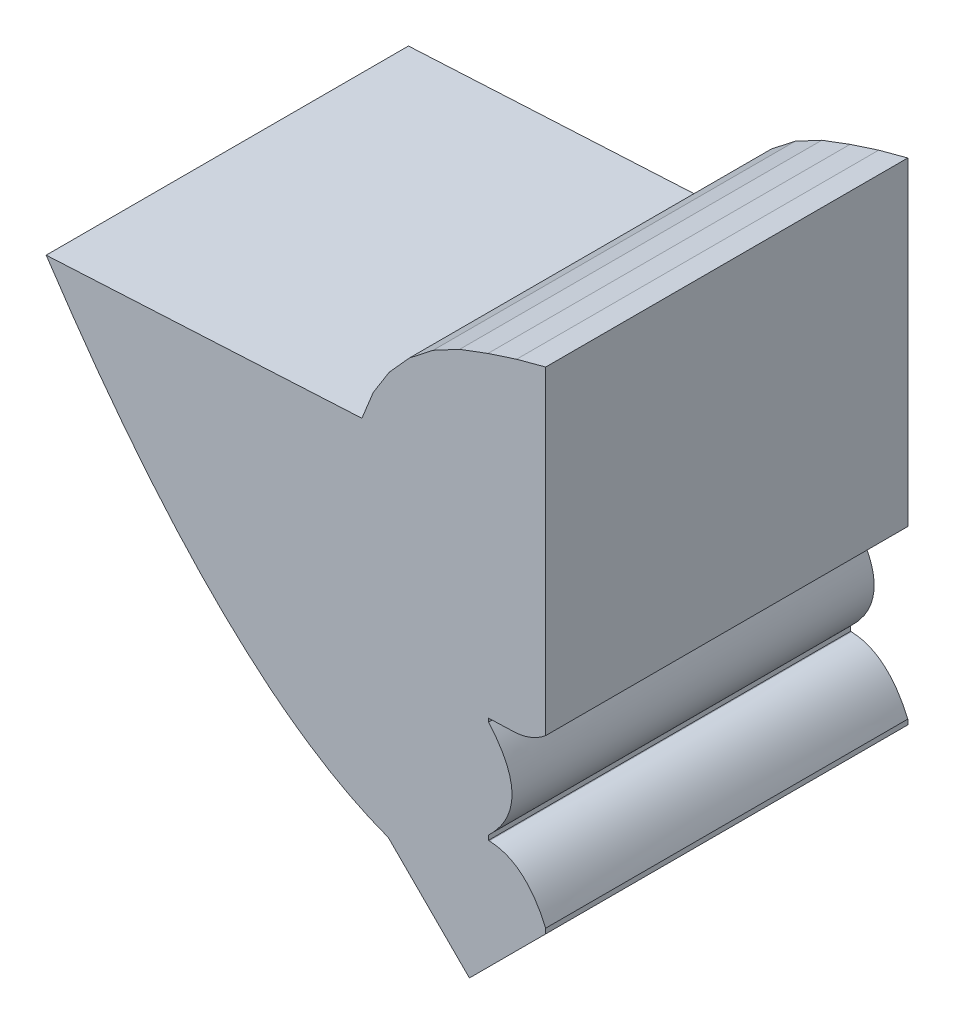
ISO-10303-21;
HEADER;
FILE_DESCRIPTION(('STEP AP214'),'2;1');
FILE_NAME('part.step','',(''),(''),'','','');
FILE_SCHEMA(('AUTOMOTIVE_DESIGN { 1 0 10303 214 1 1 1 1 }'));
ENDSEC;
DATA;
#1=APPLICATION_CONTEXT('core data for automotive mechanical design processes');
#2=APPLICATION_PROTOCOL_DEFINITION('international standard','automotive_design',2000,#1);
#3=PRODUCT_CONTEXT('',#1,'mechanical');
#4=PRODUCT('Part','Part','',(#3));
#5=PRODUCT_RELATED_PRODUCT_CATEGORY('part','',(#4));
#6=PRODUCT_DEFINITION_FORMATION('','',#4);
#7=PRODUCT_DEFINITION_CONTEXT('part definition',#1,'design');
#8=PRODUCT_DEFINITION('design','',#6,#7);
#9=PRODUCT_DEFINITION_SHAPE('','',#8);
#10=(LENGTH_UNIT() NAMED_UNIT(*) SI_UNIT(.MILLI.,.METRE.));
#11=(NAMED_UNIT(*) PLANE_ANGLE_UNIT() SI_UNIT($,.RADIAN.));
#12=(NAMED_UNIT(*) SI_UNIT($,.STERADIAN.) SOLID_ANGLE_UNIT());
#13=UNCERTAINTY_MEASURE_WITH_UNIT(LENGTH_MEASURE(1.E-05),#10,'distance_accuracy_value','');
#14=(GEOMETRIC_REPRESENTATION_CONTEXT(3) GLOBAL_UNCERTAINTY_ASSIGNED_CONTEXT((#13)) GLOBAL_UNIT_ASSIGNED_CONTEXT((#10,
#11,#12)) REPRESENTATION_CONTEXT('',''));
#15=CARTESIAN_POINT('',(0.,0.,0.));
#16=DIRECTION('',(0.,0.,1.));
#17=DIRECTION('',(1.,0.,0.));
#18=AXIS2_PLACEMENT_3D('',#15,#16,#17);
#19=CARTESIAN_POINT('',(-2.17733041778456,0.,7.21));
#20=DIRECTION('',(1.,0.,0.));
#21=DIRECTION('',(0.,1.,0.));
#22=AXIS2_PLACEMENT_3D('',#19,#20,#21);
#23=PLANE('',#22);
#24=DIRECTION('',(0.,1.,0.));
#25=VECTOR('',#24,1.);
#26=CARTESIAN_POINT('',(-2.17733041778456,0.,7.21));
#27=LINE('',#26,#25);
#28=CARTESIAN_POINT('',(-2.17733041779455,-1.68817652024789,7.21));
#29=VERTEX_POINT('',#28);
#30=CARTESIAN_POINT('',(-2.17733041778456,-1.87464458451844,7.21));
#31=VERTEX_POINT('',#30);
#32=EDGE_CURVE('E555',#29,#31,#27,.F.);
#33=ORIENTED_EDGE('',*,*,#32,.T.);
#34=DIRECTION('',(0.,0.,-1.));
#35=VECTOR('',#34,1.);
#36=CARTESIAN_POINT('',(-2.17733041778456,-1.87464458451844,7.21));
#37=LINE('',#36,#35);
#38=CARTESIAN_POINT('',(-2.17733041778456,-1.87464458451844,-7.21));
#39=VERTEX_POINT('',#38);
#40=EDGE_CURVE('E13',#31,#39,#37,.T.);
#41=ORIENTED_EDGE('',*,*,#40,.T.);
#42=DIRECTION('',(0.,1.,0.));
#43=VECTOR('',#42,1.);
#44=CARTESIAN_POINT('',(-2.17733041778456,0.,-7.21));
#45=LINE('',#44,#43);
#46=CARTESIAN_POINT('',(-2.17733041778456,-1.68817652020115,-7.21));
#47=VERTEX_POINT('',#46);
#48=EDGE_CURVE('E221',#47,#39,#45,.F.);
#49=ORIENTED_EDGE('',*,*,#48,.F.);
#50=DIRECTION('',(0.,0.,-1.));
#51=VECTOR('',#50,1.);
#52=CARTESIAN_POINT('',(-2.17733041778328,-1.68817652023794,30.8299178698776));
#53=LINE('',#52,#51);
#54=EDGE_CURVE('E594',#29,#47,#53,.T.);
#55=ORIENTED_EDGE('',*,*,#54,.F.);
#56=EDGE_LOOP('',(#33,#41,#49,#55));
#57=FACE_BOUND('',#56,.T.);
#58=ADVANCED_FACE('F59',(#57),#23,.T.);
#59=CARTESIAN_POINT('',(-82931.1005830976,996560.072871644,30.8299178698776));
#60=CARTESIAN_POINT('',(87153.8887538027,-996199.093812144,30.8299178698776));
#61=CARTESIAN_POINT('',(-91384.0928999308,995820.531871049,30.8299178698776));
#62=B_SPLINE_CURVE_WITH_KNOTS('',2,(#59,#60,#61),.UNSPECIFIED.,.F.,.F.,(3,3),(0.,1.),.UNSPECIFIED.);
#63=DIRECTION('',(0.,0.,-1.));
#64=VECTOR('',#63,1.);
#65=SURFACE_OF_LINEAR_EXTRUSION('',#62,#64);
#66=CARTESIAN_POINT('',(-10.3360060158818,-1.39847805226852,-7.21));
#67=CARTESIAN_POINT('',(-8.21435068380829,-3.01457076583251,-7.21));
#68=CARTESIAN_POINT('',(-6.16806887334853,-3.76914018510849,-7.21));
#69=B_SPLINE_CURVE_WITH_KNOTS('',2,(#66,#67,#68),.UNSPECIFIED.,.F.,.F.,(3,3),(0.500500048072499,
0.500965025000237),.UNSPECIFIED.);
#70=CARTESIAN_POINT('',(-10.3360060158632,-1.39847805228234,-7.2125366176972));
#71=VERTEX_POINT('',#70);
#72=CARTESIAN_POINT('',(-6.16806886859999,-3.76914018684615,-7.21));
#73=VERTEX_POINT('',#72);
#74=EDGE_CURVE('E551',#71,#73,#69,.T.);
#75=ORIENTED_EDGE('',*,*,#74,.T.);
#76=DIRECTION('',(0.,0.,-1.));
#77=VECTOR('',#76,1.);
#78=CARTESIAN_POINT('',(-6.16806886857457,-3.76914018687113,0.));
#79=LINE('',#78,#77);
#80=CARTESIAN_POINT('',(-6.16806891386247,-3.76914017017464,7.21));
#81=VERTEX_POINT('',#80);
#82=EDGE_CURVE('E65',#73,#81,#79,.F.);
#83=ORIENTED_EDGE('',*,*,#82,.T.);
#84=CARTESIAN_POINT('',(-6.16806891386101,-3.76914017017338,7.21));
#85=CARTESIAN_POINT('',(-8.21435070480994,-3.0145707498392,7.21));
#86=CARTESIAN_POINT('',(-10.3360060158803,-1.3984780522741,7.21));
#87=B_SPLINE_CURVE_WITH_KNOTS('',2,(#84,#85,#86),.UNSPECIFIED.,.F.,.F.,(3,3),(0.500500048077102,
0.500965025000236),.UNSPECIFIED.);
#88=CARTESIAN_POINT('',(-10.3360060158816,-1.39847805227263,7.21251805157951));
#89=VERTEX_POINT('',#88);
#90=EDGE_CURVE('E525',#89,#81,#87,.F.);
#91=ORIENTED_EDGE('',*,*,#90,.F.);
#92=CARTESIAN_POINT('',(-10.336006015861,-1.39847805228632,7.21));
#93=CARTESIAN_POINT('',(-10.6228848167366,-1.17995870432205,7.21));
#94=CARTESIAN_POINT('',(-10.9111416710362,-0.945688133646021,7.21));
#95=B_SPLINE_CURVE_WITH_KNOTS('',2,(#92,#93,#94),.UNSPECIFIED.,.F.,.F.,(3,3),(0.500965025000234,
0.501027896674745),.UNSPECIFIED.);
#96=CARTESIAN_POINT('',(-10.9111416711035,-0.945688133586594,7.21251805157951));
#97=VERTEX_POINT('',#96);
#98=EDGE_CURVE('E460',#97,#89,#95,.F.);
#99=ORIENTED_EDGE('',*,*,#98,.F.);
#100=CARTESIAN_POINT('',(-10.9111416711694,-0.945688133531575,7.21));
#101=CARTESIAN_POINT('',(-15.1971813204195,2.53763911301365,7.21));
#102=CARTESIAN_POINT('',(-19.7878835648669,9.50327575735757,7.21));
#103=B_SPLINE_CURVE_WITH_KNOTS('',2,(#100,#101,#102),.UNSPECIFIED.,.F.,.F.,(3,3),
(0.501027896674761,0.501962724366634),.UNSPECIFIED.);
#104=CARTESIAN_POINT('',(-19.7878835648708,9.50327575735899,7.21251805157951));
#105=VERTEX_POINT('',#104);
#106=EDGE_CURVE('E514',#105,#97,#103,.F.);
#107=ORIENTED_EDGE('',*,*,#106,.F.);
#108=DIRECTION('',(0.,0.,1.));
#109=VECTOR('',#108,1.);
#110=CARTESIAN_POINT('',(-19.7878835648708,9.50327575735899,-7.21507323539439));
#111=LINE('',#110,#109);
#112=CARTESIAN_POINT('',(-19.7878835648708,9.50327575735899,-7.21253661769719));
#113=VERTEX_POINT('',#112);
#114=EDGE_CURVE('E361',#113,#105,#111,.T.);
#115=ORIENTED_EDGE('',*,*,#114,.F.);
#116=CARTESIAN_POINT('',(-19.7878835648714,9.50327575734023,-7.21));
#117=CARTESIAN_POINT('',(-15.197181319061,2.53763911092818,-7.21));
#118=CARTESIAN_POINT('',(-10.9111416686287,-0.945688135617351,-7.21));
#119=B_SPLINE_CURVE_WITH_KNOTS('',2,(#116,#117,#118),.UNSPECIFIED.,.F.,.F.,(3,3),
(0.501027896674483,0.501962724366634),.UNSPECIFIED.);
#120=CARTESIAN_POINT('',(-10.9111416684846,-0.945688135711886,-7.21253661769719));
#121=VERTEX_POINT('',#120);
#122=EDGE_CURVE('E501',#113,#121,#119,.T.);
#123=ORIENTED_EDGE('',*,*,#122,.T.);
#124=CARTESIAN_POINT('',(-10.9111416684921,-0.945688135713634,-7.21));
#125=CARTESIAN_POINT('',(-10.6228848154707,-1.17995870528634,-7.21));
#126=CARTESIAN_POINT('',(-10.336006015861,-1.39847805228632,-7.21));
#127=B_SPLINE_CURVE_WITH_KNOTS('',2,(#124,#125,#126),.UNSPECIFIED.,.F.,.F.,(3,3),
(0.500965025000234,0.501027896674468),.UNSPECIFIED.);
#128=EDGE_CURVE('E447',#121,#71,#127,.T.);
#129=ORIENTED_EDGE('',*,*,#128,.T.);
#130=EDGE_LOOP('',(#75,#83,#91,#99,#107,#115,#123,#129));
#131=FACE_BOUND('',#130,.T.);
#132=ADVANCED_FACE('F416',(#131),#65,.T.);
#133=DIRECTION('',(0.,1.,0.));
#134=VECTOR('',#133,1.);
#135=CARTESIAN_POINT('',(-2.17733041778456,0.,-7.21));
#136=LINE('',#135,#134);
#137=CARTESIAN_POINT('',(-2.17733041778456,2.34248700715526,-7.21));
#138=VERTEX_POINT('',#137);
#139=CARTESIAN_POINT('',(-2.17733041777607,2.20172974209443,-7.21));
#140=VERTEX_POINT('',#139);
#141=EDGE_CURVE('E539',#138,#140,#136,.F.);
#142=ORIENTED_EDGE('',*,*,#141,.F.);
#143=DIRECTION('',(0.,0.,-1.));
#144=VECTOR('',#143,1.);
#145=CARTESIAN_POINT('',(-2.17733041778456,2.34248700715526,24.0565253000013));
#146=LINE('',#145,#144);
#147=CARTESIAN_POINT('',(-2.17733041778456,2.34248700715526,7.21));
#148=VERTEX_POINT('',#147);
#149=EDGE_CURVE('E353',#148,#138,#146,.T.);
#150=ORIENTED_EDGE('',*,*,#149,.F.);
#151=DIRECTION('',(0.,1.,0.));
#152=VECTOR('',#151,1.);
#153=CARTESIAN_POINT('',(-2.17733041778456,0.,7.21));
#154=LINE('',#153,#152);
#155=CARTESIAN_POINT('',(-2.17733041778074,2.20172974210003,7.21));
#156=VERTEX_POINT('',#155);
#157=EDGE_CURVE('E549',#148,#156,#154,.F.);
#158=ORIENTED_EDGE('',*,*,#157,.T.);
#159=DIRECTION('',(0.,0.,-1.));
#160=VECTOR('',#159,1.);
#161=CARTESIAN_POINT('',(-2.17733041778074,2.20172974210003,30.8299178698776));
#162=LINE('',#161,#160);
#163=EDGE_CURVE('E647',#156,#140,#162,.T.);
#164=ORIENTED_EDGE('',*,*,#163,.T.);
#165=EDGE_LOOP('',(#142,#150,#158,#164));
#166=FACE_BOUND('',#165,.T.);
#167=ADVANCED_FACE('F423',(#166),#23,.T.);
#168=CARTESIAN_POINT('',(0.,0.,7.21));
#169=DIRECTION('',(0.,0.,1.));
#170=DIRECTION('',(1.,0.,0.));
#171=AXIS2_PLACEMENT_3D('',#168,#169,#170);
#172=PLANE('',#171);
#173=ORIENTED_EDGE('',*,*,#90,.T.);
#174=DIRECTION('',(0.707106781186544,-0.707106781186551,0.));
#175=VECTOR('',#174,1.);
#176=CARTESIAN_POINT('',(-8.54205465500589,-1.39515440044023,7.21));
#177=LINE('',#176,#175);
#178=CARTESIAN_POINT('',(-2.93720905544618,-7.,7.21));
#179=VERTEX_POINT('',#178);
#180=EDGE_CURVE('E75',#81,#179,#177,.T.);
#181=ORIENTED_EDGE('',*,*,#180,.T.);
#182=DIRECTION('',(0.707106781186109,0.707106781186986,0.));
#183=VECTOR('',#182,1.);
#184=CARTESIAN_POINT('',(0.100000000000489,-3.96279094454957,7.21));
#185=LINE('',#184,#183);
#186=CARTESIAN_POINT('',(0.100000000000489,-3.96279094454957,7.21));
#187=VERTEX_POINT('',#186);
#188=EDGE_CURVE('E250',#179,#187,#185,.T.);
#189=ORIENTED_EDGE('',*,*,#188,.T.);
#190=DIRECTION('',(2.22058157456749E-12,1.,0.));
#191=VECTOR('',#190,1.);
#192=CARTESIAN_POINT('',(0.100000000000933,-3.76279094455367,7.21));
#193=LINE('',#192,#191);
#194=CARTESIAN_POINT('',(0.100000000000933,-3.76279094455367,7.21));
#195=VERTEX_POINT('',#194);
#196=EDGE_CURVE('E601',#187,#195,#193,.T.);
#197=ORIENTED_EDGE('',*,*,#196,.T.);
#198=CARTESIAN_POINT('',(-340142.258084091,-940378.661072562,7.21));
#199=CARTESIAN_POINT('',(342018.643325663,939690.620785911,7.21));
#200=CARTESIAN_POINT('',(-343901.028567235,-939010.58049926,7.21));
#201=B_SPLINE_CURVE_WITH_KNOTS('',2,(#198,#199,#200),.UNSPECIFIED.,.F.,.F.,(3,3),(0.,1.),.UNSPECIFIED.);
#202=CARTESIAN_POINT('',(-2.14675730902949,-1.87694782736109,7.21));
#203=VERTEX_POINT('',#202);
#204=EDGE_CURVE('E598',#195,#203,#201,.T.);
#205=ORIENTED_EDGE('',*,*,#204,.T.);
#206=DIRECTION('',(-0.99717429746257,0.0751227028269696,0.));
#207=VECTOR('',#206,1.);
#208=CARTESIAN_POINT('',(-2.14675730902949,-1.87694782736109,7.21));
#209=LINE('',#208,#207);
#210=EDGE_CURVE('E230',#203,#31,#209,.T.);
#211=ORIENTED_EDGE('',*,*,#210,.T.);
#212=ORIENTED_EDGE('',*,*,#32,.F.);
#213=CARTESIAN_POINT('',(-2.17733041777607,2.20172974209443,7.21));
#214=CARTESIAN_POINT('',(-0.307419303310444,0.0931805865995528,7.21));
#215=CARTESIAN_POINT('',(-2.17733041779435,-1.68817652026,7.21));
#216=B_SPLINE_CURVE_WITH_KNOTS('',2,(#213,#214,#215),.UNSPECIFIED.,.F.,.F.,(3,3),
(0.49947186766891,0.500440643667569),.UNSPECIFIED.);
#217=EDGE_CURVE('E597',#156,#29,#216,.T.);
#218=ORIENTED_EDGE('',*,*,#217,.F.);
#219=ORIENTED_EDGE('',*,*,#157,.F.);
#220=DIRECTION('',(0.999390827019096,0.0348994967025048,0.));
#221=VECTOR('',#220,1.);
#222=CARTESIAN_POINT('',(-2.17733041778456,2.34248700715526,7.21));
#223=LINE('',#222,#221);
#224=CARTESIAN_POINT('',(-1.19050164048462,2.37694782742692,7.21000000000002));
#225=VERTEX_POINT('',#224);
#226=EDGE_CURVE('E78',#148,#225,#223,.T.);
#227=ORIENTED_EDGE('',*,*,#226,.T.);
#228=CARTESIAN_POINT('',(-343900.072311573,939011.080499257,7.21000000000001));
#229=CARTESIAN_POINT('',(342019.599581338,-939690.120785908,7.21000000000001));
#230=CARTESIAN_POINT('',(-340141.301828429,940379.16107256,7.21000000000001));
#231=B_SPLINE_CURVE_WITH_KNOTS('',2,(#228,#229,#230),.UNSPECIFIED.,.F.,.F.,(3,3),(0.,1.),.UNSPECIFIED.);
#232=CARTESIAN_POINT('',(0.100000000004221,2.87767341815847,7.21000000000001));
#233=VERTEX_POINT('',#232);
#234=EDGE_CURVE('E296',#225,#233,#231,.T.);
#235=ORIENTED_EDGE('',*,*,#234,.T.);
#236=DIRECTION('',(0.,1.,0.));
#237=VECTOR('',#236,1.);
#238=CARTESIAN_POINT('',(0.100000000004221,2.87767341815847,7.21));
#239=LINE('',#238,#237);
#240=CARTESIAN_POINT('',(0.100000000004747,15.587903347272,7.21));
#241=VERTEX_POINT('',#240);
#242=EDGE_CURVE('E335',#233,#241,#239,.T.);
#243=ORIENTED_EDGE('',*,*,#242,.T.);
#244=DIRECTION('',(-0.96592582628907,-0.258819045102515,0.));
#245=VECTOR('',#244,1.);
#246=CARTESIAN_POINT('',(-1.05911099154214,15.277320493149,7.21));
#247=LINE('',#246,#245);
#248=CARTESIAN_POINT('',(-1.05911099154214,15.277320493149,7.21000000000001));
#249=VERTEX_POINT('',#248);
#250=EDGE_CURVE('E330',#241,#249,#247,.T.);
#251=ORIENTED_EDGE('',*,*,#250,.T.);
#252=DIRECTION('',(-0.951056516295155,-0.309016994374943,0.));
#253=VECTOR('',#252,1.);
#254=CARTESIAN_POINT('',(-2.20037881109632,14.906500099899,7.21));
#255=LINE('',#254,#253);
#256=CARTESIAN_POINT('',(-2.20037881109632,14.906500099899,7.21000000000001));
#257=VERTEX_POINT('',#256);
#258=EDGE_CURVE('E328',#249,#257,#255,.T.);
#259=ORIENTED_EDGE('',*,*,#258,.T.);
#260=DIRECTION('',(-0.9366721892484,-0.350207381259461,0.));
#261=VECTOR('',#260,1.);
#262=CARTESIAN_POINT('',(-3.3243854381944,14.4862512423877,7.21));
#263=LINE('',#262,#261);
#264=CARTESIAN_POINT('',(-3.3243854381944,14.4862512423877,7.21000000000001));
#265=VERTEX_POINT('',#264);
#266=EDGE_CURVE('E324',#257,#265,#263,.T.);
#267=ORIENTED_EDGE('',*,*,#266,.T.);
#268=DIRECTION('',(-0.882947592859007,-0.46947156278574,0.));
#269=VECTOR('',#268,1.);
#270=CARTESIAN_POINT('',(-4.38392254962521,13.9228853670448,7.21));
#271=LINE('',#270,#269);
#272=CARTESIAN_POINT('',(-4.38392254962521,13.9228853670448,7.21000000000001));
#273=VERTEX_POINT('',#272);
#274=EDGE_CURVE('E318',#265,#273,#271,.T.);
#275=ORIENTED_EDGE('',*,*,#274,.T.);
#276=DIRECTION('',(-0.788010753606726,-0.615661475325654,0.));
#277=VECTOR('',#276,1.);
#278=CARTESIAN_POINT('',(-5.32953545395328,13.184091596654,7.21));
#279=LINE('',#278,#277);
#280=CARTESIAN_POINT('',(-5.32953545395328,13.184091596654,7.21000000000001));
#281=VERTEX_POINT('',#280);
#282=EDGE_CURVE('E320',#273,#281,#279,.T.);
#283=ORIENTED_EDGE('',*,*,#282,.T.);
#284=DIRECTION('',(-0.669130606358526,-0.743144825477694,0.));
#285=VECTOR('',#284,1.);
#286=CARTESIAN_POINT('',(-6.13249218158351,12.2923178060808,7.21));
#287=LINE('',#286,#285);
#288=CARTESIAN_POINT('',(-6.13249218158351,12.2923178060808,7.21000000000001));
#289=VERTEX_POINT('',#288);
#290=EDGE_CURVE('E313',#281,#289,#287,.T.);
#291=ORIENTED_EDGE('',*,*,#290,.T.);
#292=DIRECTION('',(-0.52991926423321,-0.848048096156423,0.));
#293=VECTOR('',#292,1.);
#294=CARTESIAN_POINT('',(-6.76839529866336,11.2746600906931,7.21));
#295=LINE('',#294,#293);
#296=CARTESIAN_POINT('',(-6.76839529866336,11.2746600906931,7.21000000000001));
#297=VERTEX_POINT('',#296);
#298=EDGE_CURVE('E311',#289,#297,#295,.T.);
#299=ORIENTED_EDGE('',*,*,#298,.T.);
#300=DIRECTION('',(-0.374606593415918,-0.927183854566785,0.));
#301=VECTOR('',#300,1.);
#302=CARTESIAN_POINT('',(-7.21792321076246,10.1620394652129,7.21));
#303=LINE('',#302,#301);
#304=CARTESIAN_POINT('',(-7.21792321076246,10.1620394652129,7.21000000000001));
#305=VERTEX_POINT('',#304);
#306=EDGE_CURVE('E308',#297,#305,#303,.T.);
#307=ORIENTED_EDGE('',*,*,#306,.T.);
#308=DIRECTION('',(-0.998629534754494,-0.0523359562444688,0.));
#309=VECTOR('',#308,1.);
#310=CARTESIAN_POINT('',(-10.3098203952063,10.,7.21));
#311=LINE('',#310,#309);
#312=EDGE_CURVE('E303',#305,#105,#311,.T.);
#313=ORIENTED_EDGE('',*,*,#312,.T.);
#314=ORIENTED_EDGE('',*,*,#106,.T.);
#315=ORIENTED_EDGE('',*,*,#98,.T.);
#316=EDGE_LOOP('',(#173,#181,#189,#197,#205,#211,#212,#218,#219,#227,#235,#243,#251,#259,#267,
#275,#283,#291,#299,#307,#313,#314,#315));
#317=FACE_BOUND('',#316,.T.);
#318=ADVANCED_FACE('F481',(#317),#172,.T.);
#319=CARTESIAN_POINT('',(0.,0.,-7.21));
#320=DIRECTION('',(0.,0.,1.));
#321=DIRECTION('',(1.,0.,0.));
#322=AXIS2_PLACEMENT_3D('',#319,#320,#321);
#323=PLANE('',#322);
#324=ORIENTED_EDGE('',*,*,#48,.T.);
#325=DIRECTION('',(0.99717429746257,-0.0751227028269696,0.));
#326=VECTOR('',#325,1.);
#327=CARTESIAN_POINT('',(-2.14675730902949,-1.87694782736109,-7.21));
#328=LINE('',#327,#326);
#329=CARTESIAN_POINT('',(-2.14675730902949,-1.87694782736109,-7.21));
#330=VERTEX_POINT('',#329);
#331=EDGE_CURVE('E214',#39,#330,#328,.T.);
#332=ORIENTED_EDGE('',*,*,#331,.T.);
#333=CARTESIAN_POINT('',(-340142.258084091,-940378.661072562,-7.21));
#334=CARTESIAN_POINT('',(342018.643325663,939690.620785911,-7.21));
#335=CARTESIAN_POINT('',(-343901.028567235,-939010.58049926,-7.21));
#336=B_SPLINE_CURVE_WITH_KNOTS('',2,(#333,#334,#335),.UNSPECIFIED.,.F.,.F.,(3,3),(0.,1.),.UNSPECIFIED.);
#337=CARTESIAN_POINT('',(0.100000000000933,-3.76279094455367,-7.21));
#338=VERTEX_POINT('',#337);
#339=EDGE_CURVE('E217',#330,#338,#336,.F.);
#340=ORIENTED_EDGE('',*,*,#339,.T.);
#341=DIRECTION('',(-2.22058157456749E-12,-1.,0.));
#342=VECTOR('',#341,1.);
#343=CARTESIAN_POINT('',(0.100000000000933,-3.76279094455367,-7.21));
#344=LINE('',#343,#342);
#345=CARTESIAN_POINT('',(0.100000000000488,-3.96279094454957,-7.21));
#346=VERTEX_POINT('',#345);
#347=EDGE_CURVE('E236',#338,#346,#344,.T.);
#348=ORIENTED_EDGE('',*,*,#347,.T.);
#349=DIRECTION('',(-0.707106781186109,-0.707106781186986,0.));
#350=VECTOR('',#349,1.);
#351=CARTESIAN_POINT('',(0.100000000000489,-3.96279094454957,-7.21));
#352=LINE('',#351,#350);
#353=CARTESIAN_POINT('',(-2.93720905544618,-7.,-7.21));
#354=VERTEX_POINT('',#353);
#355=EDGE_CURVE('E238',#346,#354,#352,.T.);
#356=ORIENTED_EDGE('',*,*,#355,.T.);
#357=DIRECTION('',(-0.707106781186544,0.707106781186551,0.));
#358=VECTOR('',#357,1.);
#359=CARTESIAN_POINT('',(-8.54205465500589,-1.39515440044023,-7.21));
#360=LINE('',#359,#358);
#361=EDGE_CURVE('E257',#354,#73,#360,.T.);
#362=ORIENTED_EDGE('',*,*,#361,.T.);
#363=ORIENTED_EDGE('',*,*,#74,.F.);
#364=ORIENTED_EDGE('',*,*,#128,.F.);
#365=ORIENTED_EDGE('',*,*,#122,.F.);
#366=DIRECTION('',(-0.998629534754494,-0.0523359562444688,0.));
#367=VECTOR('',#366,1.);
#368=CARTESIAN_POINT('',(-0.550881453784725,10.5114443180936,-7.21));
#369=LINE('',#368,#367);
#370=CARTESIAN_POINT('',(-7.21792321076246,10.1620394652129,-7.21));
#371=VERTEX_POINT('',#370);
#372=EDGE_CURVE('E529',#371,#113,#369,.T.);
#373=ORIENTED_EDGE('',*,*,#372,.F.);
#374=DIRECTION('',(0.374606593415918,0.927183854566785,0.));
#375=VECTOR('',#374,1.);
#376=CARTESIAN_POINT('',(-7.21792321076246,10.1620394652129,-7.21));
#377=LINE('',#376,#375);
#378=CARTESIAN_POINT('',(-6.76839529866336,11.2746600906931,-7.21));
#379=VERTEX_POINT('',#378);
#380=EDGE_CURVE('E274',#371,#379,#377,.T.);
#381=ORIENTED_EDGE('',*,*,#380,.T.);
#382=DIRECTION('',(0.52991926423321,0.848048096156423,0.));
#383=VECTOR('',#382,1.);
#384=CARTESIAN_POINT('',(-6.76839529866336,11.2746600906931,-7.21));
#385=LINE('',#384,#383);
#386=CARTESIAN_POINT('',(-6.13249218158351,12.2923178060808,-7.21));
#387=VERTEX_POINT('',#386);
#388=EDGE_CURVE('E272',#379,#387,#385,.T.);
#389=ORIENTED_EDGE('',*,*,#388,.T.);
#390=DIRECTION('',(0.669130606358526,0.743144825477694,0.));
#391=VECTOR('',#390,1.);
#392=CARTESIAN_POINT('',(-6.13249218158351,12.2923178060808,-7.21));
#393=LINE('',#392,#391);
#394=CARTESIAN_POINT('',(-5.32953545395328,13.184091596654,-7.21));
#395=VERTEX_POINT('',#394);
#396=EDGE_CURVE('E269',#387,#395,#393,.T.);
#397=ORIENTED_EDGE('',*,*,#396,.T.);
#398=DIRECTION('',(0.788010753606726,0.615661475325654,0.));
#399=VECTOR('',#398,1.);
#400=CARTESIAN_POINT('',(-5.32953545395328,13.184091596654,-7.21));
#401=LINE('',#400,#399);
#402=CARTESIAN_POINT('',(-4.38392254962521,13.9228853670448,-7.21));
#403=VERTEX_POINT('',#402);
#404=EDGE_CURVE('E261',#395,#403,#401,.T.);
#405=ORIENTED_EDGE('',*,*,#404,.T.);
#406=DIRECTION('',(0.882947592859007,0.46947156278574,0.));
#407=VECTOR('',#406,1.);
#408=CARTESIAN_POINT('',(-4.38392254962521,13.9228853670448,-7.21));
#409=LINE('',#408,#407);
#410=CARTESIAN_POINT('',(-3.3243854381944,14.4862512423877,-7.21));
#411=VERTEX_POINT('',#410);
#412=EDGE_CURVE('E264',#403,#411,#409,.T.);
#413=ORIENTED_EDGE('',*,*,#412,.T.);
#414=DIRECTION('',(0.9366721892484,0.350207381259461,0.));
#415=VECTOR('',#414,1.);
#416=CARTESIAN_POINT('',(-3.3243854381944,14.4862512423877,-7.21));
#417=LINE('',#416,#415);
#418=CARTESIAN_POINT('',(-2.20037881109632,14.906500099899,-7.21000000000001));
#419=VERTEX_POINT('',#418);
#420=EDGE_CURVE('E249',#411,#419,#417,.T.);
#421=ORIENTED_EDGE('',*,*,#420,.T.);
#422=DIRECTION('',(0.951056516295155,0.309016994374943,0.));
#423=VECTOR('',#422,1.);
#424=CARTESIAN_POINT('',(-2.20037881109632,14.906500099899,-7.21));
#425=LINE('',#424,#423);
#426=CARTESIAN_POINT('',(-1.05911099154214,15.277320493149,-7.21));
#427=VERTEX_POINT('',#426);
#428=EDGE_CURVE('E295',#419,#427,#425,.T.);
#429=ORIENTED_EDGE('',*,*,#428,.T.);
#430=DIRECTION('',(0.96592582628907,0.258819045102515,0.));
#431=VECTOR('',#430,1.);
#432=CARTESIAN_POINT('',(-1.05911099154214,15.277320493149,-7.21));
#433=LINE('',#432,#431);
#434=CARTESIAN_POINT('',(0.100000000004747,15.587903347272,-7.21));
#435=VERTEX_POINT('',#434);
#436=EDGE_CURVE('E293',#427,#435,#433,.T.);
#437=ORIENTED_EDGE('',*,*,#436,.T.);
#438=DIRECTION('',(0.,-1.,0.));
#439=VECTOR('',#438,1.);
#440=CARTESIAN_POINT('',(0.100000000004221,2.87767341815847,-7.21));
#441=LINE('',#440,#439);
#442=CARTESIAN_POINT('',(0.0999999999995449,2.8776734181557,-7.21000000000001));
#443=VERTEX_POINT('',#442);
#444=EDGE_CURVE('E281',#435,#443,#441,.T.);
#445=ORIENTED_EDGE('',*,*,#444,.T.);
#446=CARTESIAN_POINT('',(-343900.072311573,939011.080499257,-7.21000000000001));
#447=CARTESIAN_POINT('',(342019.599581338,-939690.120785908,-7.21000000000001));
#448=CARTESIAN_POINT('',(-340141.301828429,940379.16107256,-7.21000000000001));
#449=B_SPLINE_CURVE_WITH_KNOTS('',2,(#446,#447,#448),.UNSPECIFIED.,.F.,.F.,(3,3),(0.,1.),.UNSPECIFIED.);
#450=CARTESIAN_POINT('',(-1.19050164048462,2.37694782741517,-7.21));
#451=VERTEX_POINT('',#450);
#452=EDGE_CURVE('E280',#443,#451,#449,.F.);
#453=ORIENTED_EDGE('',*,*,#452,.T.);
#454=DIRECTION('',(-0.999390827019096,-0.0348994967025048,0.));
#455=VECTOR('',#454,1.);
#456=CARTESIAN_POINT('',(-2.17733041778456,2.34248700715526,-7.21));
#457=LINE('',#456,#455);
#458=EDGE_CURVE('E277',#451,#138,#457,.T.);
#459=ORIENTED_EDGE('',*,*,#458,.T.);
#460=ORIENTED_EDGE('',*,*,#141,.T.);
#461=CARTESIAN_POINT('',(-2.17733041776379,-1.68817652023098,-7.21));
#462=CARTESIAN_POINT('',(-0.307419303328964,0.0931805866132554,-7.21));
#463=CARTESIAN_POINT('',(-2.17733041776824,2.20172974208621,-7.21));
#464=B_SPLINE_CURVE_WITH_KNOTS('',2,(#461,#462,#463),.UNSPECIFIED.,.F.,.F.,(3,3),
(0.499471867668912,0.500440643667561),.UNSPECIFIED.);
#465=EDGE_CURVE('E648',#47,#140,#464,.T.);
#466=ORIENTED_EDGE('',*,*,#465,.F.);
#467=EDGE_LOOP('',(#324,#332,#340,#348,#356,#362,#363,#364,#365,#373,#381,#389,#397,#405,#413,
#421,#429,#437,#445,#453,#459,#460,#466));
#468=FACE_BOUND('',#467,.T.);
#469=ADVANCED_FACE('F215',(#468),#323,.F.);
#470=CARTESIAN_POINT('',(-996021.636606251,89148.1321438377,30.8299178698776));
#471=CARTESIAN_POINT('',(996193.448091746,-87155.7427476542,30.8299178698776));
#472=CARTESIAN_POINT('',(-996370.259577241,85163.3533514707,30.8299178698776));
#473=B_SPLINE_CURVE_WITH_KNOTS('',2,(#470,#471,#472),.UNSPECIFIED.,.F.,.F.,(3,3),(0.,1.),.UNSPECIFIED.);
#474=DIRECTION('',(0.,0.,-1.));
#475=VECTOR('',#474,1.);
#476=SURFACE_OF_LINEAR_EXTRUSION('',#473,#475);
#477=ORIENTED_EDGE('',*,*,#163,.F.);
#478=ORIENTED_EDGE('',*,*,#217,.T.);
#479=ORIENTED_EDGE('',*,*,#54,.T.);
#480=ORIENTED_EDGE('',*,*,#465,.T.);
#481=EDGE_LOOP('',(#477,#478,#479,#480));
#482=FACE_BOUND('',#481,.T.);
#483=ADVANCED_FACE('F415',(#482),#476,.T.);
#484=CARTESIAN_POINT('',(-19.7878835648708,9.50327575735899,-7.21507323539439));
#485=DIRECTION('',(-0.0523359562444688,0.998629534754494,0.));
#486=DIRECTION('',(-0.998629534754494,-0.0523359562444688,0.));
#487=AXIS2_PLACEMENT_3D('',#484,#485,#486);
#488=PLANE('',#487);
#489=ORIENTED_EDGE('',*,*,#312,.F.);
#490=DIRECTION('',(0.,0.,-1.));
#491=VECTOR('',#490,1.);
#492=CARTESIAN_POINT('',(-7.21792321076246,10.1620394652129,24.0565253000013));
#493=LINE('',#492,#491);
#494=EDGE_CURVE('E346',#305,#371,#493,.T.);
#495=ORIENTED_EDGE('',*,*,#494,.T.);
#496=ORIENTED_EDGE('',*,*,#372,.T.);
#497=ORIENTED_EDGE('',*,*,#114,.T.);
#498=EDGE_LOOP('',(#489,#495,#496,#497));
#499=FACE_BOUND('',#498,.T.);
#500=ADVANCED_FACE('F410',(#499),#488,.T.);
#501=CARTESIAN_POINT('',(-1.05911099154214,15.277320493149,24.0565253000013));
#502=DIRECTION('',(0.258819045102515,-0.96592582628907,0.));
#503=DIRECTION('',(0.96592582628907,0.258819045102515,0.));
#504=AXIS2_PLACEMENT_3D('',#501,#502,#503);
#505=PLANE('',#504);
#506=ORIENTED_EDGE('',*,*,#250,.F.);
#507=DIRECTION('',(0.,0.,-1.));
#508=VECTOR('',#507,1.);
#509=CARTESIAN_POINT('',(0.100000000004747,15.587903347272,24.0565253000013));
#510=LINE('',#509,#508);
#511=EDGE_CURVE('E300',#241,#435,#510,.T.);
#512=ORIENTED_EDGE('',*,*,#511,.T.);
#513=ORIENTED_EDGE('',*,*,#436,.F.);
#514=DIRECTION('',(0.,0.,-1.));
#515=VECTOR('',#514,1.);
#516=CARTESIAN_POINT('',(-1.05911099154214,15.277320493149,24.0565253000013));
#517=LINE('',#516,#515);
#518=EDGE_CURVE('E337',#249,#427,#517,.T.);
#519=ORIENTED_EDGE('',*,*,#518,.F.);
#520=EDGE_LOOP('',(#506,#512,#513,#519));
#521=FACE_BOUND('',#520,.T.);
#522=ADVANCED_FACE('F406',(#521),#505,.F.);
#523=CARTESIAN_POINT('',(-2.20037881109632,14.906500099899,24.0565253000013));
#524=DIRECTION('',(0.309016994374943,-0.951056516295155,0.));
#525=DIRECTION('',(0.951056516295155,0.309016994374943,0.));
#526=AXIS2_PLACEMENT_3D('',#523,#524,#525);
#527=PLANE('',#526);
#528=ORIENTED_EDGE('',*,*,#258,.F.);
#529=ORIENTED_EDGE('',*,*,#518,.T.);
#530=ORIENTED_EDGE('',*,*,#428,.F.);
#531=DIRECTION('',(0.,0.,-1.));
#532=VECTOR('',#531,1.);
#533=CARTESIAN_POINT('',(-2.20037881109632,14.906500099899,24.0565253000013));
#534=LINE('',#533,#532);
#535=EDGE_CURVE('E336',#257,#419,#534,.T.);
#536=ORIENTED_EDGE('',*,*,#535,.F.);
#537=EDGE_LOOP('',(#528,#529,#530,#536));
#538=FACE_BOUND('',#537,.T.);
#539=ADVANCED_FACE('F405',(#538),#527,.F.);
#540=CARTESIAN_POINT('',(-3.3243854381944,14.4862512423877,24.0565253000013));
#541=DIRECTION('',(0.350207381259461,-0.9366721892484,0.));
#542=DIRECTION('',(0.9366721892484,0.350207381259461,0.));
#543=AXIS2_PLACEMENT_3D('',#540,#541,#542);
#544=PLANE('',#543);
#545=ORIENTED_EDGE('',*,*,#266,.F.);
#546=ORIENTED_EDGE('',*,*,#535,.T.);
#547=ORIENTED_EDGE('',*,*,#420,.F.);
#548=DIRECTION('',(0.,0.,-1.));
#549=VECTOR('',#548,1.);
#550=CARTESIAN_POINT('',(-3.3243854381944,14.4862512423877,24.0565253000013));
#551=LINE('',#550,#549);
#552=EDGE_CURVE('E338',#265,#411,#551,.T.);
#553=ORIENTED_EDGE('',*,*,#552,.F.);
#554=EDGE_LOOP('',(#545,#546,#547,#553));
#555=FACE_BOUND('',#554,.T.);
#556=ADVANCED_FACE('F399',(#555),#544,.F.);
#557=CARTESIAN_POINT('',(-4.38392254962521,13.9228853670448,24.0565253000013));
#558=DIRECTION('',(0.46947156278574,-0.882947592859007,0.));
#559=DIRECTION('',(0.882947592859007,0.46947156278574,0.));
#560=AXIS2_PLACEMENT_3D('',#557,#558,#559);
#561=PLANE('',#560);
#562=ORIENTED_EDGE('',*,*,#274,.F.);
#563=ORIENTED_EDGE('',*,*,#552,.T.);
#564=ORIENTED_EDGE('',*,*,#412,.F.);
#565=DIRECTION('',(0.,0.,-1.));
#566=VECTOR('',#565,1.);
#567=CARTESIAN_POINT('',(-4.38392254962521,13.9228853670448,24.0565253000013));
#568=LINE('',#567,#566);
#569=EDGE_CURVE('E342',#273,#403,#568,.T.);
#570=ORIENTED_EDGE('',*,*,#569,.F.);
#571=EDGE_LOOP('',(#562,#563,#564,#570));
#572=FACE_BOUND('',#571,.T.);
#573=ADVANCED_FACE('F395',(#572),#561,.F.);
#574=CARTESIAN_POINT('',(-5.32953545395328,13.184091596654,24.0565253000013));
#575=DIRECTION('',(0.615661475325654,-0.788010753606726,0.));
#576=DIRECTION('',(0.788010753606726,0.615661475325654,0.));
#577=AXIS2_PLACEMENT_3D('',#574,#575,#576);
#578=PLANE('',#577);
#579=ORIENTED_EDGE('',*,*,#282,.F.);
#580=ORIENTED_EDGE('',*,*,#569,.T.);
#581=ORIENTED_EDGE('',*,*,#404,.F.);
#582=DIRECTION('',(0.,0.,-1.));
#583=VECTOR('',#582,1.);
#584=CARTESIAN_POINT('',(-5.32953545395328,13.184091596654,24.0565253000013));
#585=LINE('',#584,#583);
#586=EDGE_CURVE('E343',#281,#395,#585,.T.);
#587=ORIENTED_EDGE('',*,*,#586,.F.);
#588=EDGE_LOOP('',(#579,#580,#581,#587));
#589=FACE_BOUND('',#588,.T.);
#590=ADVANCED_FACE('F390',(#589),#578,.F.);
#591=CARTESIAN_POINT('',(-6.13249218158351,12.2923178060808,24.0565253000013));
#592=DIRECTION('',(0.743144825477693,-0.669130606358526,0.));
#593=DIRECTION('',(0.669130606358526,0.743144825477694,0.));
#594=AXIS2_PLACEMENT_3D('',#591,#592,#593);
#595=PLANE('',#594);
#596=ORIENTED_EDGE('',*,*,#290,.F.);
#597=ORIENTED_EDGE('',*,*,#586,.T.);
#598=ORIENTED_EDGE('',*,*,#396,.F.);
#599=DIRECTION('',(0.,0.,-1.));
#600=VECTOR('',#599,1.);
#601=CARTESIAN_POINT('',(-6.13249218158351,12.2923178060808,24.0565253000013));
#602=LINE('',#601,#600);
#603=EDGE_CURVE('E348',#289,#387,#602,.T.);
#604=ORIENTED_EDGE('',*,*,#603,.F.);
#605=EDGE_LOOP('',(#596,#597,#598,#604));
#606=FACE_BOUND('',#605,.T.);
#607=ADVANCED_FACE('F386',(#606),#595,.F.);
#608=CARTESIAN_POINT('',(-6.76839529866336,11.2746600906931,24.0565253000013));
#609=DIRECTION('',(0.848048096156423,-0.52991926423321,0.));
#610=DIRECTION('',(0.52991926423321,0.848048096156423,0.));
#611=AXIS2_PLACEMENT_3D('',#608,#609,#610);
#612=PLANE('',#611);
#613=ORIENTED_EDGE('',*,*,#298,.F.);
#614=ORIENTED_EDGE('',*,*,#603,.T.);
#615=ORIENTED_EDGE('',*,*,#388,.F.);
#616=DIRECTION('',(0.,0.,-1.));
#617=VECTOR('',#616,1.);
#618=CARTESIAN_POINT('',(-6.76839529866336,11.2746600906931,24.0565253000013));
#619=LINE('',#618,#617);
#620=EDGE_CURVE('E347',#297,#379,#619,.T.);
#621=ORIENTED_EDGE('',*,*,#620,.F.);
#622=EDGE_LOOP('',(#613,#614,#615,#621));
#623=FACE_BOUND('',#622,.T.);
#624=ADVANCED_FACE('F385',(#623),#612,.F.);
#625=CARTESIAN_POINT('',(-7.21792321076246,10.1620394652129,24.0565253000013));
#626=DIRECTION('',(0.927183854566785,-0.374606593415918,0.));
#627=DIRECTION('',(0.374606593415918,0.927183854566785,0.));
#628=AXIS2_PLACEMENT_3D('',#625,#626,#627);
#629=PLANE('',#628);
#630=ORIENTED_EDGE('',*,*,#306,.F.);
#631=ORIENTED_EDGE('',*,*,#620,.T.);
#632=ORIENTED_EDGE('',*,*,#380,.F.);
#633=ORIENTED_EDGE('',*,*,#494,.F.);
#634=EDGE_LOOP('',(#630,#631,#632,#633));
#635=FACE_BOUND('',#634,.T.);
#636=ADVANCED_FACE('F378',(#635),#629,.F.);
#637=CARTESIAN_POINT('',(-2.17733041778456,2.34248700715526,24.0565253000013));
#638=DIRECTION('',(-0.0348994967025048,0.999390827019096,0.));
#639=DIRECTION('',(-0.999390827019096,-0.0348994967025048,0.));
#640=AXIS2_PLACEMENT_3D('',#637,#638,#639);
#641=PLANE('',#640);
#642=ORIENTED_EDGE('',*,*,#226,.F.);
#643=ORIENTED_EDGE('',*,*,#149,.T.);
#644=ORIENTED_EDGE('',*,*,#458,.F.);
#645=DIRECTION('',(0.,0.,-1.));
#646=VECTOR('',#645,1.);
#647=CARTESIAN_POINT('',(-1.19050164048462,2.37694782742692,24.0565253000013));
#648=LINE('',#647,#646);
#649=EDGE_CURVE('E354',#225,#451,#648,.T.);
#650=ORIENTED_EDGE('',*,*,#649,.F.);
#651=EDGE_LOOP('',(#642,#643,#644,#650));
#652=FACE_BOUND('',#651,.T.);
#653=ADVANCED_FACE('F372',(#652),#641,.F.);
#654=CARTESIAN_POINT('',(-343900.072311573,939011.080499257,24.0565253000013));
#655=CARTESIAN_POINT('',(342019.599581338,-939690.120785908,24.0565253000013));
#656=CARTESIAN_POINT('',(-340141.301828429,940379.16107256,24.0565253000013));
#657=B_SPLINE_CURVE_WITH_KNOTS('',2,(#654,#655,#656),.UNSPECIFIED.,.F.,.F.,(3,3),(0.,1.),.UNSPECIFIED.);
#658=DIRECTION('',(0.,0.,-1.));
#659=VECTOR('',#658,1.);
#660=SURFACE_OF_LINEAR_EXTRUSION('',#657,#659);
#661=ORIENTED_EDGE('',*,*,#234,.F.);
#662=ORIENTED_EDGE('',*,*,#649,.T.);
#663=ORIENTED_EDGE('',*,*,#452,.F.);
#664=DIRECTION('',(0.,0.,-1.));
#665=VECTOR('',#664,1.);
#666=CARTESIAN_POINT('',(0.100000000004221,2.87767341815847,24.0565253000013));
#667=LINE('',#666,#665);
#668=EDGE_CURVE('E333',#233,#443,#667,.T.);
#669=ORIENTED_EDGE('',*,*,#668,.F.);
#670=EDGE_LOOP('',(#661,#662,#663,#669));
#671=FACE_BOUND('',#670,.T.);
#672=ADVANCED_FACE('F367',(#671),#660,.F.);
#673=CARTESIAN_POINT('',(0.100000000004221,2.87767341815847,24.0565253000013));
#674=DIRECTION('',(-1.,0.,0.));
#675=DIRECTION('',(0.,-1.,0.));
#676=AXIS2_PLACEMENT_3D('',#673,#674,#675);
#677=PLANE('',#676);
#678=ORIENTED_EDGE('',*,*,#242,.F.);
#679=ORIENTED_EDGE('',*,*,#668,.T.);
#680=ORIENTED_EDGE('',*,*,#444,.F.);
#681=ORIENTED_EDGE('',*,*,#511,.F.);
#682=EDGE_LOOP('',(#678,#679,#680,#681));
#683=FACE_BOUND('',#682,.T.);
#684=ADVANCED_FACE('F373',(#683),#677,.F.);
#685=CARTESIAN_POINT('',(-340142.258084091,-940378.661072562,17.5104564391599));
#686=CARTESIAN_POINT('',(342018.643325663,939690.620785911,17.5104564391599));
#687=CARTESIAN_POINT('',(-343901.028567235,-939010.58049926,17.5104564391599));
#688=B_SPLINE_CURVE_WITH_KNOTS('',2,(#685,#686,#687),.UNSPECIFIED.,.F.,.F.,(3,3),(0.,1.),.UNSPECIFIED.);
#689=DIRECTION('',(0.,0.,-1.));
#690=VECTOR('',#689,1.);
#691=SURFACE_OF_LINEAR_EXTRUSION('',#688,#690);
#692=ORIENTED_EDGE('',*,*,#204,.F.);
#693=DIRECTION('',(0.,0.,-1.));
#694=VECTOR('',#693,1.);
#695=CARTESIAN_POINT('',(0.100000000000933,-3.76279094455367,17.5104564391599));
#696=LINE('',#695,#694);
#697=EDGE_CURVE('E223',#195,#338,#696,.T.);
#698=ORIENTED_EDGE('',*,*,#697,.T.);
#699=ORIENTED_EDGE('',*,*,#339,.F.);
#700=DIRECTION('',(0.,0.,-1.));
#701=VECTOR('',#700,1.);
#702=CARTESIAN_POINT('',(-2.14675730902949,-1.87694782736109,17.5104564391599));
#703=LINE('',#702,#701);
#704=EDGE_CURVE('E228',#203,#330,#703,.T.);
#705=ORIENTED_EDGE('',*,*,#704,.F.);
#706=EDGE_LOOP('',(#692,#698,#699,#705));
#707=FACE_BOUND('',#706,.T.);
#708=ADVANCED_FACE('F232',(#707),#691,.F.);
#709=CARTESIAN_POINT('',(-2.14675730902949,-1.87694782736109,17.5104564391599));
#710=DIRECTION('',(-0.0751227028269696,-0.99717429746257,0.));
#711=DIRECTION('',(0.99717429746257,-0.0751227028269696,0.));
#712=AXIS2_PLACEMENT_3D('',#709,#710,#711);
#713=PLANE('',#712);
#714=ORIENTED_EDGE('',*,*,#40,.F.);
#715=ORIENTED_EDGE('',*,*,#210,.F.);
#716=ORIENTED_EDGE('',*,*,#704,.T.);
#717=ORIENTED_EDGE('',*,*,#331,.F.);
#718=EDGE_LOOP('',(#714,#715,#716,#717));
#719=FACE_BOUND('',#718,.T.);
#720=ADVANCED_FACE('F227',(#719),#713,.F.);
#721=CARTESIAN_POINT('',(-8.54205465500589,-1.39515440044023,17.5104564391599));
#722=DIRECTION('',(0.707106781186551,0.707106781186544,0.));
#723=DIRECTION('',(-0.707106781186544,0.707106781186551,0.));
#724=AXIS2_PLACEMENT_3D('',#721,#722,#723);
#725=PLANE('',#724);
#726=ORIENTED_EDGE('',*,*,#82,.F.);
#727=ORIENTED_EDGE('',*,*,#361,.F.);
#728=DIRECTION('',(0.,0.,-1.));
#729=VECTOR('',#728,1.);
#730=CARTESIAN_POINT('',(-2.93720905544618,-7.,17.5104564391599));
#731=LINE('',#730,#729);
#732=EDGE_CURVE('E231',#179,#354,#731,.T.);
#733=ORIENTED_EDGE('',*,*,#732,.F.);
#734=ORIENTED_EDGE('',*,*,#180,.F.);
#735=EDGE_LOOP('',(#726,#727,#733,#734));
#736=FACE_BOUND('',#735,.T.);
#737=ADVANCED_FACE('F625',(#736),#725,.F.);
#738=CARTESIAN_POINT('',(0.100000000000489,-3.96279094454957,17.5104564391599));
#739=DIRECTION('',(-0.707106781186986,0.707106781186109,0.));
#740=DIRECTION('',(-0.707106781186109,-0.707106781186986,0.));
#741=AXIS2_PLACEMENT_3D('',#738,#739,#740);
#742=PLANE('',#741);
#743=ORIENTED_EDGE('',*,*,#188,.F.);
#744=ORIENTED_EDGE('',*,*,#732,.T.);
#745=ORIENTED_EDGE('',*,*,#355,.F.);
#746=DIRECTION('',(0.,0.,-1.));
#747=VECTOR('',#746,1.);
#748=CARTESIAN_POINT('',(0.100000000000489,-3.96279094454957,17.5104564391599));
#749=LINE('',#748,#747);
#750=EDGE_CURVE('E602',#187,#346,#749,.T.);
#751=ORIENTED_EDGE('',*,*,#750,.F.);
#752=EDGE_LOOP('',(#743,#744,#745,#751));
#753=FACE_BOUND('',#752,.T.);
#754=ADVANCED_FACE('F622',(#753),#742,.F.);
#755=CARTESIAN_POINT('',(0.100000000000933,-3.76279094455367,17.5104564391599));
#756=DIRECTION('',(-1.,2.22058157456749E-12,0.));
#757=DIRECTION('',(-2.22058157456749E-12,-1.,0.));
#758=AXIS2_PLACEMENT_3D('',#755,#756,#757);
#759=PLANE('',#758);
#760=ORIENTED_EDGE('',*,*,#196,.F.);
#761=ORIENTED_EDGE('',*,*,#750,.T.);
#762=ORIENTED_EDGE('',*,*,#347,.F.);
#763=ORIENTED_EDGE('',*,*,#697,.F.);
#764=EDGE_LOOP('',(#760,#761,#762,#763));
#765=FACE_BOUND('',#764,.T.);
#766=ADVANCED_FACE('F628',(#765),#759,.F.);
#767=CLOSED_SHELL('',(#58,#132,#167,#318,#469,#483,#500,#522,#539,#556,#573,#590,#607,#624,#636,
#653,#672,#684,#708,#720,#737,#754,#766));
#768=MANIFOLD_SOLID_BREP('B2',#767);
#769=ADVANCED_BREP_SHAPE_REPRESENTATION('',(#18,#768),#14);
#770=SHAPE_DEFINITION_REPRESENTATION(#9,#769);
ENDSEC;
END-ISO-10303-21;
